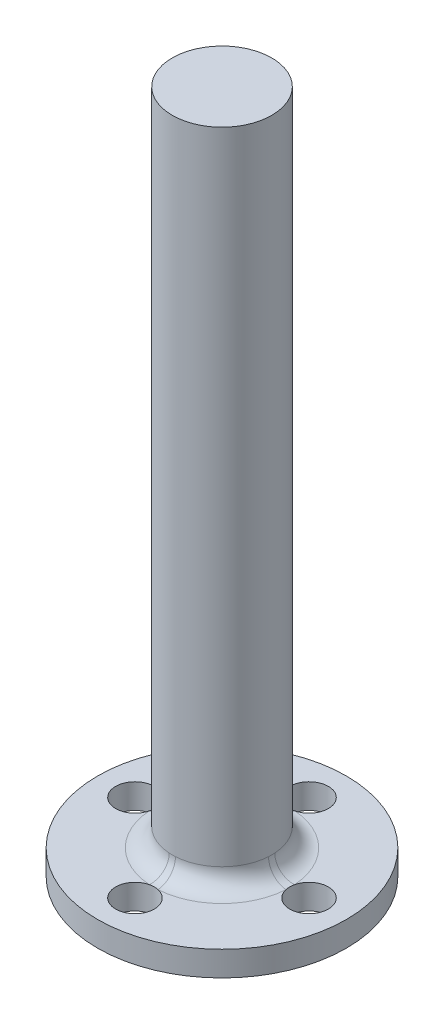
ISO-10303-21;
HEADER;
FILE_DESCRIPTION(('STEP AP214'),'2;1');
FILE_NAME('part.step','',(''),(''),'','','');
FILE_SCHEMA(('AUTOMOTIVE_DESIGN { 1 0 10303 214 1 1 1 1 }'));
ENDSEC;
DATA;
#1=APPLICATION_CONTEXT('core data for automotive mechanical design processes');
#2=APPLICATION_PROTOCOL_DEFINITION('international standard','automotive_design',2000,#1);
#3=PRODUCT_CONTEXT('',#1,'mechanical');
#4=PRODUCT('Part','Part','',(#3));
#5=PRODUCT_RELATED_PRODUCT_CATEGORY('part','',(#4));
#6=PRODUCT_DEFINITION_FORMATION('','',#4);
#7=PRODUCT_DEFINITION_CONTEXT('part definition',#1,'design');
#8=PRODUCT_DEFINITION('design','',#6,#7);
#9=PRODUCT_DEFINITION_SHAPE('','',#8);
#10=(LENGTH_UNIT() NAMED_UNIT(*) SI_UNIT(.MILLI.,.METRE.));
#11=(NAMED_UNIT(*) PLANE_ANGLE_UNIT() SI_UNIT($,.RADIAN.));
#12=(NAMED_UNIT(*) SI_UNIT($,.STERADIAN.) SOLID_ANGLE_UNIT());
#13=UNCERTAINTY_MEASURE_WITH_UNIT(LENGTH_MEASURE(1.E-05),#10,'distance_accuracy_value','');
#14=(GEOMETRIC_REPRESENTATION_CONTEXT(3) GLOBAL_UNCERTAINTY_ASSIGNED_CONTEXT((#13)) GLOBAL_UNIT_ASSIGNED_CONTEXT((#10,
#11,#12)) REPRESENTATION_CONTEXT('',''));
#15=CARTESIAN_POINT('',(0.,0.,0.));
#16=DIRECTION('',(0.,0.,1.));
#17=DIRECTION('',(1.,0.,0.));
#18=AXIS2_PLACEMENT_3D('',#15,#16,#17);
#19=CARTESIAN_POINT('',(0.,2.,0.));
#20=DIRECTION('',(0.,-1.,0.));
#21=DIRECTION('',(0.,0.,-1.));
#22=AXIS2_PLACEMENT_3D('',#19,#20,#21);
#23=CYLINDRICAL_SURFACE('',#22,10.);
#24=CARTESIAN_POINT('',(0.,2.,0.));
#25=DIRECTION('',(0.,1.,0.));
#26=DIRECTION('',(0.,0.,1.));
#27=AXIS2_PLACEMENT_3D('',#24,#25,#26);
#28=CIRCLE('',#27,10.);
#29=CARTESIAN_POINT('',(0.,2.,10.));
#30=VERTEX_POINT('',#29);
#31=EDGE_CURVE('E136',#30,#30,#28,.T.);
#32=ORIENTED_EDGE('',*,*,#31,.F.);
#33=EDGE_LOOP('',(#32));
#34=FACE_BOUND('',#33,.T.);
#35=CARTESIAN_POINT('',(0.,0.,0.));
#36=DIRECTION('',(0.,1.,0.));
#37=DIRECTION('',(0.,0.,1.));
#38=AXIS2_PLACEMENT_3D('',#35,#36,#37);
#39=CIRCLE('',#38,10.);
#40=CARTESIAN_POINT('',(0.,0.,10.));
#41=VERTEX_POINT('',#40);
#42=EDGE_CURVE('E139',#41,#41,#39,.T.);
#43=ORIENTED_EDGE('',*,*,#42,.T.);
#44=EDGE_LOOP('',(#43));
#45=FACE_BOUND('',#44,.T.);
#46=ADVANCED_FACE('F40',(#34,#45),#23,.T.);
#47=CARTESIAN_POINT('',(0.,2.,0.));
#48=DIRECTION('',(0.,1.,0.));
#49=DIRECTION('',(0.,0.,1.));
#50=AXIS2_PLACEMENT_3D('',#47,#48,#49);
#51=PLANE('',#50);
#52=CARTESIAN_POINT('',(0.,2.,7.));
#53=DIRECTION('',(0.,1.,0.));
#54=DIRECTION('',(0.,0.,1.));
#55=AXIS2_PLACEMENT_3D('',#52,#53,#54);
#56=CIRCLE('',#55,1.55);
#57=CARTESIAN_POINT('',(-0.345980887094494,2.,5.48910714285714));
#58=VERTEX_POINT('',#57);
#59=CARTESIAN_POINT('',(0.345980887094494,2.,5.48910714285714));
#60=VERTEX_POINT('',#59);
#61=EDGE_CURVE('E317',#58,#60,#56,.T.);
#62=ORIENTED_EDGE('',*,*,#61,.F.);
#63=CARTESIAN_POINT('',(0.,2.,0.));
#64=DIRECTION('',(0.,1.,0.));
#65=DIRECTION('',(0.,0.,1.));
#66=AXIS2_PLACEMENT_3D('',#63,#64,#65);
#67=CIRCLE('',#66,5.5);
#68=CARTESIAN_POINT('',(-5.48910714285714,2.,0.345980887094495));
#69=VERTEX_POINT('',#68);
#70=EDGE_CURVE('E11',#58,#69,#67,.F.);
#71=ORIENTED_EDGE('',*,*,#70,.T.);
#72=CARTESIAN_POINT('',(-7.,2.,0.));
#73=DIRECTION('',(0.,1.,0.));
#74=DIRECTION('',(0.,0.,1.));
#75=AXIS2_PLACEMENT_3D('',#72,#73,#74);
#76=CIRCLE('',#75,1.55);
#77=CARTESIAN_POINT('',(-5.48910714285714,2.,-0.345980887094495));
#78=VERTEX_POINT('',#77);
#79=EDGE_CURVE('E310',#78,#69,#76,.T.);
#80=ORIENTED_EDGE('',*,*,#79,.F.);
#81=CARTESIAN_POINT('',(0.,2.,0.));
#82=DIRECTION('',(0.,1.,0.));
#83=DIRECTION('',(0.,0.,1.));
#84=AXIS2_PLACEMENT_3D('',#81,#82,#83);
#85=CIRCLE('',#84,5.5);
#86=CARTESIAN_POINT('',(-0.345980887094494,2.,-5.48910714285714));
#87=VERTEX_POINT('',#86);
#88=EDGE_CURVE('E53',#78,#87,#85,.F.);
#89=ORIENTED_EDGE('',*,*,#88,.T.);
#90=CARTESIAN_POINT('',(0.,2.,-7.));
#91=DIRECTION('',(0.,1.,0.));
#92=DIRECTION('',(0.,0.,1.));
#93=AXIS2_PLACEMENT_3D('',#90,#91,#92);
#94=CIRCLE('',#93,1.55);
#95=CARTESIAN_POINT('',(0.345980887094494,2.,-5.48910714285714));
#96=VERTEX_POINT('',#95);
#97=EDGE_CURVE('E294',#96,#87,#94,.T.);
#98=ORIENTED_EDGE('',*,*,#97,.F.);
#99=CARTESIAN_POINT('',(0.,2.,0.));
#100=DIRECTION('',(0.,1.,0.));
#101=DIRECTION('',(0.,0.,1.));
#102=AXIS2_PLACEMENT_3D('',#99,#100,#101);
#103=CIRCLE('',#102,5.5);
#104=CARTESIAN_POINT('',(5.48910714285714,2.,-0.345980887094495));
#105=VERTEX_POINT('',#104);
#106=EDGE_CURVE('E329',#96,#105,#103,.F.);
#107=ORIENTED_EDGE('',*,*,#106,.T.);
#108=CARTESIAN_POINT('',(7.,2.,0.));
#109=DIRECTION('',(0.,1.,0.));
#110=DIRECTION('',(0.,0.,1.));
#111=AXIS2_PLACEMENT_3D('',#108,#109,#110);
#112=CIRCLE('',#111,1.55);
#113=CARTESIAN_POINT('',(5.48910714285714,2.,0.345980887094495));
#114=VERTEX_POINT('',#113);
#115=EDGE_CURVE('E305',#114,#105,#112,.T.);
#116=ORIENTED_EDGE('',*,*,#115,.F.);
#117=CARTESIAN_POINT('',(0.,2.,0.));
#118=DIRECTION('',(0.,1.,0.));
#119=DIRECTION('',(0.,0.,1.));
#120=AXIS2_PLACEMENT_3D('',#117,#118,#119);
#121=CIRCLE('',#120,5.5);
#122=EDGE_CURVE('E69',#114,#60,#121,.F.);
#123=ORIENTED_EDGE('',*,*,#122,.T.);
#124=EDGE_LOOP('',(#62,#71,#80,#89,#98,#107,#116,#123));
#125=FACE_BOUND('',#124,.T.);
#126=ORIENTED_EDGE('',*,*,#31,.T.);
#127=EDGE_LOOP('',(#126));
#128=FACE_BOUND('',#127,.T.);
#129=ADVANCED_FACE('F203',(#125,#128),#51,.T.);
#130=CARTESIAN_POINT('',(0.,0.,0.));
#131=DIRECTION('',(0.,1.,0.));
#132=DIRECTION('',(0.,0.,1.));
#133=AXIS2_PLACEMENT_3D('',#130,#131,#132);
#134=PLANE('',#133);
#135=CARTESIAN_POINT('',(0.,0.,-7.));
#136=DIRECTION('',(0.,1.,0.));
#137=DIRECTION('',(0.,0.,1.));
#138=AXIS2_PLACEMENT_3D('',#135,#136,#137);
#139=CIRCLE('',#138,1.55);
#140=CARTESIAN_POINT('',(0.,0.,-5.45));
#141=VERTEX_POINT('',#140);
#142=EDGE_CURVE('E292',#141,#141,#139,.T.);
#143=ORIENTED_EDGE('',*,*,#142,.T.);
#144=EDGE_LOOP('',(#143));
#145=FACE_BOUND('',#144,.T.);
#146=CARTESIAN_POINT('',(7.,0.,0.));
#147=DIRECTION('',(0.,1.,0.));
#148=DIRECTION('',(0.,0.,1.));
#149=AXIS2_PLACEMENT_3D('',#146,#147,#148);
#150=CIRCLE('',#149,1.55);
#151=CARTESIAN_POINT('',(7.,0.,1.55));
#152=VERTEX_POINT('',#151);
#153=EDGE_CURVE('E306',#152,#152,#150,.T.);
#154=ORIENTED_EDGE('',*,*,#153,.T.);
#155=EDGE_LOOP('',(#154));
#156=FACE_BOUND('',#155,.T.);
#157=CARTESIAN_POINT('',(-7.,0.,0.));
#158=DIRECTION('',(0.,1.,0.));
#159=DIRECTION('',(0.,0.,1.));
#160=AXIS2_PLACEMENT_3D('',#157,#158,#159);
#161=CIRCLE('',#160,1.55);
#162=CARTESIAN_POINT('',(-7.,0.,1.55));
#163=VERTEX_POINT('',#162);
#164=EDGE_CURVE('E311',#163,#163,#161,.T.);
#165=ORIENTED_EDGE('',*,*,#164,.T.);
#166=EDGE_LOOP('',(#165));
#167=FACE_BOUND('',#166,.T.);
#168=CARTESIAN_POINT('',(0.,0.,7.));
#169=DIRECTION('',(0.,1.,0.));
#170=DIRECTION('',(0.,0.,1.));
#171=AXIS2_PLACEMENT_3D('',#168,#169,#170);
#172=CIRCLE('',#171,1.55);
#173=CARTESIAN_POINT('',(0.,0.,8.55));
#174=VERTEX_POINT('',#173);
#175=EDGE_CURVE('E216',#174,#174,#172,.T.);
#176=ORIENTED_EDGE('',*,*,#175,.T.);
#177=EDGE_LOOP('',(#176));
#178=FACE_BOUND('',#177,.T.);
#179=ORIENTED_EDGE('',*,*,#42,.F.);
#180=EDGE_LOOP('',(#179));
#181=FACE_BOUND('',#180,.T.);
#182=ADVANCED_FACE('F250',(#145,#156,#167,#178,#181),#134,.F.);
#183=CARTESIAN_POINT('',(0.,0.,7.));
#184=DIRECTION('',(0.,1.,0.));
#185=DIRECTION('',(0.,0.,1.));
#186=AXIS2_PLACEMENT_3D('',#183,#184,#185);
#187=CYLINDRICAL_SURFACE('',#186,1.55);
#188=ORIENTED_EDGE('',*,*,#175,.F.);
#189=EDGE_LOOP('',(#188));
#190=FACE_BOUND('',#189,.T.);
#191=EDGE_CURVE('E314',#60,#58,#56,.T.);
#192=ORIENTED_EDGE('',*,*,#191,.T.);
#193=ORIENTED_EDGE('',*,*,#61,.T.);
#194=EDGE_LOOP('',(#192,#193));
#195=FACE_BOUND('',#194,.T.);
#196=ADVANCED_FACE('F246',(#190,#195),#187,.F.);
#197=CARTESIAN_POINT('',(-7.,0.,0.));
#198=DIRECTION('',(0.,1.,0.));
#199=DIRECTION('',(0.,0.,1.));
#200=AXIS2_PLACEMENT_3D('',#197,#198,#199);
#201=CYLINDRICAL_SURFACE('',#200,1.55);
#202=ORIENTED_EDGE('',*,*,#164,.F.);
#203=EDGE_LOOP('',(#202));
#204=FACE_BOUND('',#203,.T.);
#205=EDGE_CURVE('E130',#69,#78,#76,.T.);
#206=ORIENTED_EDGE('',*,*,#205,.T.);
#207=ORIENTED_EDGE('',*,*,#79,.T.);
#208=EDGE_LOOP('',(#206,#207));
#209=FACE_BOUND('',#208,.T.);
#210=ADVANCED_FACE('F242',(#204,#209),#201,.F.);
#211=CARTESIAN_POINT('',(7.,0.,0.));
#212=DIRECTION('',(0.,1.,0.));
#213=DIRECTION('',(0.,0.,1.));
#214=AXIS2_PLACEMENT_3D('',#211,#212,#213);
#215=CYLINDRICAL_SURFACE('',#214,1.55);
#216=ORIENTED_EDGE('',*,*,#153,.F.);
#217=EDGE_LOOP('',(#216));
#218=FACE_BOUND('',#217,.T.);
#219=EDGE_CURVE('E302',#105,#114,#112,.T.);
#220=ORIENTED_EDGE('',*,*,#219,.T.);
#221=ORIENTED_EDGE('',*,*,#115,.T.);
#222=EDGE_LOOP('',(#220,#221));
#223=FACE_BOUND('',#222,.T.);
#224=ADVANCED_FACE('F239',(#218,#223),#215,.F.);
#225=CARTESIAN_POINT('',(0.,0.,-7.));
#226=DIRECTION('',(0.,1.,0.));
#227=DIRECTION('',(0.,0.,1.));
#228=AXIS2_PLACEMENT_3D('',#225,#226,#227);
#229=CYLINDRICAL_SURFACE('',#228,1.55);
#230=ORIENTED_EDGE('',*,*,#142,.F.);
#231=EDGE_LOOP('',(#230));
#232=FACE_BOUND('',#231,.T.);
#233=ORIENTED_EDGE('',*,*,#97,.T.);
#234=EDGE_CURVE('E299',#87,#96,#94,.T.);
#235=ORIENTED_EDGE('',*,*,#234,.T.);
#236=EDGE_LOOP('',(#233,#235));
#237=FACE_BOUND('',#236,.T.);
#238=ADVANCED_FACE('F206',(#232,#237),#229,.F.);
#239=CARTESIAN_POINT('',(0.,55.,0.));
#240=DIRECTION('',(0.,-1.,0.));
#241=DIRECTION('',(0.,0.,-1.));
#242=AXIS2_PLACEMENT_3D('',#239,#240,#241);
#243=CYLINDRICAL_SURFACE('',#242,4.);
#244=CARTESIAN_POINT('',(0.,3.5,0.));
#245=DIRECTION('',(0.,1.,0.));
#246=DIRECTION('',(0.,0.,1.));
#247=AXIS2_PLACEMENT_3D('',#244,#245,#246);
#248=CIRCLE('',#247,4.);
#249=CARTESIAN_POINT('',(-3.99207792207792,3.5,0.251622463341451));
#250=VERTEX_POINT('',#249);
#251=CARTESIAN_POINT('',(-0.25162246334145,3.5,3.99207792207792));
#252=VERTEX_POINT('',#251);
#253=EDGE_CURVE('E118',#250,#252,#248,.T.);
#254=ORIENTED_EDGE('',*,*,#253,.T.);
#255=CARTESIAN_POINT('',(-0.361521076099163,3.49911207602319,3.98362931402209));
#256=CARTESIAN_POINT('',(-0.340557433812597,1.9510744450636,3.98553179990141));
#257=CARTESIAN_POINT('',(-0.481075078234115,2.,5.52654597319698));
#258=CARTESIAN_POINT('',(-0.341169289567039,3.49949305413539,3.98547628528082));
#259=CARTESIAN_POINT('',(-0.325941845869578,1.96143642629953,3.98675269966854));
#260=CARTESIAN_POINT('',(-0.457335073898442,2.,5.51879244406059));
#261=CARTESIAN_POINT('',(-0.320802799030429,3.4997247894396,3.98716731860821));
#262=CARTESIAN_POINT('',(-0.310158413698894,1.97115541888168,3.98800557620045));
#263=CARTESIAN_POINT('',(-0.432817859200321,2.,5.51142628596647));
#264=CARTESIAN_POINT('',(-0.280046115357363,3.49998614958444,3.9902370576335));
#265=CARTESIAN_POINT('',(-0.276705869880172,1.98903273135539,3.99045232067523));
#266=CARTESIAN_POINT('',(-0.3823979688548,2.,5.49768368701782));
#267=CARTESIAN_POINT('',(-0.259655922921662,3.50001578025563,3.99161577234045));
#268=CARTESIAN_POINT('',(-0.259033460153279,1.99720791225527,3.99164758750056));
#269=CARTESIAN_POINT('',(-0.356495333197441,2.,5.49130721761673));
#270=CARTESIAN_POINT('',(-0.198460993701503,3.49994609061047,3.99528264326616));
#271=CARTESIAN_POINT('',(-0.203800236794141,2.0190876302581,3.99497359486318));
#272=CARTESIAN_POINT('',(-0.276966316952157,2.,5.47398538698659));
#273=CARTESIAN_POINT('',(-0.157627507119827,3.49968822928615,3.99710192537397));
#274=CARTESIAN_POINT('',(-0.16367989946642,2.03034811905124,3.99687256001646));
#275=CARTESIAN_POINT('',(-0.221513626909851,2.,5.46484583594881));
#276=CARTESIAN_POINT('',(-0.0760813963235047,3.49929317886829,3.99948360676481));
#277=CARTESIAN_POINT('',(-0.0805479566624256,2.04509049291042,3.99940528517017));
#278=CARTESIAN_POINT('',(-0.108148905830593,2.,5.45273260020271));
#279=CARTESIAN_POINT('',(-0.0353689112574483,3.49915552949099,4.00005081303115));
#280=CARTESIAN_POINT('',(-0.0373531925887264,2.04867807985562,4.00005657630907));
#281=CARTESIAN_POINT('',(-0.0502471534790846,2.,5.44973533714329));
#282=CARTESIAN_POINT('',(0.0460574573006376,3.49917886836804,3.99994204665249));
#283=CARTESIAN_POINT('',(0.0486549396002544,2.04799760095561,3.99993546336476));
#284=CARTESIAN_POINT('',(0.0654335637877948,2.,5.45030186098863));
#285=CARTESIAN_POINT('',(0.0867713406809714,3.49933987821367,3.9992659841266));
#286=CARTESIAN_POINT('',(0.0917020616883922,2.04372526920508,3.99916229217689));
#287=CARTESIAN_POINT('',(0.123212519523378,2.,5.45386612225234));
#288=CARTESIAN_POINT('',(0.168177993408399,3.49974636985027,3.99667053621939));
#289=CARTESIAN_POINT('',(0.174124059103146,2.02769325918776,3.99642713009462));
#290=CARTESIAN_POINT('',(0.235920098341727,2.,5.46700676618722));
#291=CARTESIAN_POINT('',(0.208870744301876,3.49999189064555,3.99475057638104));
#292=CARTESIAN_POINT('',(0.213685627472917,2.01584819109445,3.99445110112391));
#293=CARTESIAN_POINT('',(0.290847391803203,2.,5.47658592659794));
#294=CARTESIAN_POINT('',(0.290171109194465,3.50000766199723,3.98966907870329));
#295=CARTESIAN_POINT('',(0.286182949380538,1.98557030469705,3.98991686675835));
#296=CARTESIAN_POINT('',(0.395698054527282,2.,5.50039317586401));
#297=CARTESIAN_POINT('',(0.330778738885873,3.49977800962225,3.98650779454913));
#298=CARTESIAN_POINT('',(0.319199572132066,1.967010148672,3.98734363627979));
#299=CARTESIAN_POINT('',(0.445622443601418,2.,5.51462031472801));
#300=CARTESIAN_POINT('',(0.412037558620527,3.49805053510408,3.97893155117973));
#301=CARTESIAN_POINT('',(0.376394115115969,1.92464418712722,3.98250281930757));
#302=CARTESIAN_POINT('',(0.539484446777143,2.,5.5460660719692));
#303=CARTESIAN_POINT('',(0.45268824553697,3.49654752122097,3.97451150881508));
#304=CARTESIAN_POINT('',(0.40048520144857,1.90068949250711,3.98023458298619));
#305=CARTESIAN_POINT('',(0.583396695549351,2.,5.56329670740981));
#306=CARTESIAN_POINT('',(0.513511318927077,3.49265880699111,3.96695401061248));
#307=CARTESIAN_POINT('',(0.42855013406295,1.86250978802111,3.97789743048194));
#308=CARTESIAN_POINT('',(0.644359131364173,2.,5.59010791085802));
#309=CARTESIAN_POINT('',(0.533768837494382,3.49108917931401,3.96427892583789));
#310=CARTESIAN_POINT('',(0.436589667355683,1.84931152950892,3.97729510669977));
#311=CARTESIAN_POINT('',(0.663869599549783,2.,5.59920996400092));
#312=CARTESIAN_POINT('',(0.574212502171614,3.48729062695154,3.95862315301435));
#313=CARTESIAN_POINT('',(0.449899931061895,1.82240956217904,3.97658633310932));
#314=CARTESIAN_POINT('',(0.701282840823423,2.,5.61756190774449));
#315=CARTESIAN_POINT('',(0.594398632030759,3.48506156084237,3.95564239950106));
#316=CARTESIAN_POINT('',(0.455147692726704,1.80870010762991,3.97648408551951));
#317=CARTESIAN_POINT('',(0.719185267974732,2.,5.6268118296543));
#318=CARTESIAN_POINT('',(0.614537470054878,3.48244607504984,3.95251106233728));
#319=CARTESIAN_POINT('',(0.4589395525944,1.79496437593095,3.97670346788248));
#320=CARTESIAN_POINT('',(0.736297623671463,2.,5.63604772467078));
#321=(BOUNDED_SURFACE() B_SPLINE_SURFACE(3,2,((#255,#256,#257),(#258,#259,#260),(#261,#262,
#263),(#264,#265,#266),(#267,#268,#269),(#270,#271,#272),(#273,#274,#275),(#276,#277,#278),
(#279,#280,#281),(#282,#283,#284),(#285,#286,#287),(#288,#289,#290),(#291,#292,#293),(#294,#295,
#296),(#297,#298,#299),(#300,#301,#302),(#303,#304,#305),(#306,#307,#308),(#309,#310,#311),
(#312,#313,#314),(#315,#316,#317),(#318,#319,#320)),.UNSPECIFIED.,.F.,.F.,
.F.) B_SPLINE_SURFACE_WITH_KNOTS((4,2,2,2,2,2,2,2,2,2,4),(3,3),(0.,0.0843006135304719,
0.168598795043869,0.337176950433966,0.505106764780137,0.67304871992376,0.84106828941148,
1.00905353916589,1.1777270116458,1.26213616851825,1.34656344099736),(0.,1.),
.UNSPECIFIED.) GEOMETRIC_REPRESENTATION_ITEM() RATIONAL_B_SPLINE_SURFACE(((1.,0.69584305437805,
1.),(1.,0.698182006969627,1.),(1.,0.700400353668558,1.),(1.,0.704533107916885,1.),(1.,
0.706447524232879,1.),(1.,0.711640612775357,1.),(1.,0.714369656833073,1.),(1.,0.717982871475651,
1.),(1.,0.718874096962592,1.),(1.,0.718705405881698,1.),(1.,0.717645348247769,1.),(1.,
0.713724421575925,1.),(1.,0.710862720519756,1.),(1.,0.703721358186997,1.),(1.,0.699441986662831,
1.),(1.,0.689952967066959,1.),(1.,0.684739579551679,1.),(1.,0.676627261368165,1.),(1.,
0.67387320544877,1.),(1.,0.668328076953154,1.),(1.,0.665536996559396,1.),(1.,0.662757908384818,1.))) REPRESENTATION_ITEM('') SURFACE());
#322=CARTESIAN_POINT('',(-0.361521076099163,3.49911207602319,3.98362931402209));
#323=CARTESIAN_POINT('',(-0.341169289567039,3.49949305413539,3.98547628528082));
#324=CARTESIAN_POINT('',(-0.320802799030428,3.4997247894396,3.98716731860821));
#325=CARTESIAN_POINT('',(-0.280046115357363,3.49998614958444,3.9902370576335));
#326=CARTESIAN_POINT('',(-0.259655922921662,3.50001578025563,3.99161577234045));
#327=CARTESIAN_POINT('',(-0.198460993701503,3.49994609061047,3.99528264326616));
#328=CARTESIAN_POINT('',(-0.157627507119827,3.49968822928615,3.99710192537397));
#329=CARTESIAN_POINT('',(-0.0760813963235048,3.49929317886829,3.99948360676481));
#330=CARTESIAN_POINT('',(-0.0353689112574484,3.49915552949099,4.00005081303115));
#331=CARTESIAN_POINT('',(0.0460574573006376,3.49917886836804,3.99994204665249));
#332=CARTESIAN_POINT('',(0.0867713406809714,3.49933987821367,3.9992659841266));
#333=CARTESIAN_POINT('',(0.168177993408399,3.49974636985027,3.99667053621939));
#334=CARTESIAN_POINT('',(0.208870744301876,3.49999189064555,3.99475057638104));
#335=CARTESIAN_POINT('',(0.290171109194465,3.50000766199723,3.98966907870329));
#336=CARTESIAN_POINT('',(0.330778738885873,3.49977800962225,3.98650779454913));
#337=CARTESIAN_POINT('',(0.412037558620527,3.49805053510408,3.97893155117973));
#338=CARTESIAN_POINT('',(0.45268824553697,3.49654752122097,3.97451150881508));
#339=CARTESIAN_POINT('',(0.513511318927077,3.49265880699111,3.96695401061248));
#340=CARTESIAN_POINT('',(0.533768837494382,3.49108917931401,3.96427892583789));
#341=CARTESIAN_POINT('',(0.574212502171614,3.48729062695154,3.95862315301435));
#342=CARTESIAN_POINT('',(0.594398632030759,3.48506156084237,3.95564239950106));
#343=CARTESIAN_POINT('',(0.614537470054878,3.48244607504984,3.95251106233728));
#344=B_SPLINE_CURVE_WITH_KNOTS('',3,(#322,#323,#324,#325,#326,#327,#328,#329,#330,#331,#332,
#333,#334,#335,#336,#337,#338,#339,#340,#341,#342,#343),.UNSPECIFIED.,.F.,.F.,(4,2,2,2,2,2,2,2,
2,2,4),(0.,0.0843006135304719,0.168598795043869,0.337176950433966,0.505106764780137,
0.67304871992376,0.84106828941148,1.00905353916589,1.1777270116458,1.26213616851825,
1.34656344099736),.UNSPECIFIED.);
#345=CARTESIAN_POINT('',(0.25162246334145,3.5,3.99207792207792));
#346=VERTEX_POINT('',#345);
#347=EDGE_CURVE('E332',#252,#346,#344,.T.);
#348=ORIENTED_EDGE('',*,*,#347,.T.);
#349=CARTESIAN_POINT('',(0.,3.5,0.));
#350=DIRECTION('',(0.,1.,0.));
#351=DIRECTION('',(0.,0.,1.));
#352=AXIS2_PLACEMENT_3D('',#349,#350,#351);
#353=CIRCLE('',#352,4.);
#354=CARTESIAN_POINT('',(3.99207792207792,3.5,0.251622463341451));
#355=VERTEX_POINT('',#354);
#356=EDGE_CURVE('E326',#346,#355,#353,.T.);
#357=ORIENTED_EDGE('',*,*,#356,.T.);
#358=CARTESIAN_POINT('',(3.98362931402209,3.49911207602319,0.361521076099161));
#359=CARTESIAN_POINT('',(3.98553179906173,1.95107444091582,0.340557443065116));
#360=CARTESIAN_POINT('',(5.52654597625501,2.,0.481075087600366));
#361=CARTESIAN_POINT('',(3.98547628528079,3.49949305413538,0.34116928956738));
#362=CARTESIAN_POINT('',(3.98675269936068,1.96143642478083,0.32594184926099));
#363=CARTESIAN_POINT('',(5.51879244518781,2.,0.457335077350503));
#364=CARTESIAN_POINT('',(3.98716731860815,3.49972478943959,0.320802799031113));
#365=CARTESIAN_POINT('',(3.98800557611651,1.97115541846797,0.310158414623307));
#366=CARTESIAN_POINT('',(5.51142628627549,2.,0.432817860146654));
#367=CARTESIAN_POINT('',(3.99023705763341,3.49998614958443,0.280046115358708));
#368=CARTESIAN_POINT('',(3.99045232075816,1.98903273176306,0.276705868968243));
#369=CARTESIAN_POINT('',(5.49768368670975,2.,0.382397967911929));
#370=CARTESIAN_POINT('',(3.99161577234034,3.50001578025563,0.259655922923325));
#371=CARTESIAN_POINT('',(3.99164758752925,1.99720791239612,0.259033459838794));
#372=CARTESIAN_POINT('',(5.49130721750974,2.,0.356495332871001));
#373=CARTESIAN_POINT('',(3.9952826432661,3.49994609061048,0.198460993702824));
#374=CARTESIAN_POINT('',(3.99497359480605,2.01908762997782,0.203800237421272));
#375=CARTESIAN_POINT('',(5.47398538720268,2.,0.276966317614831));
#376=CARTESIAN_POINT('',(3.99710192537395,3.49968822928615,0.157627507120487));
#377=CARTESIAN_POINT('',(3.99687256000111,2.03034811897582,0.163679899632544));
#378=CARTESIAN_POINT('',(5.46484583600735,2.,0.221513627086877));
#379=CARTESIAN_POINT('',(3.99948360676481,3.49929317886829,0.0760813963235036));
#380=CARTESIAN_POINT('',(3.99940528518529,2.04509049298462,0.0805479565010772));
#381=CARTESIAN_POINT('',(5.45273260014456,2.,0.108148905655759));
#382=CARTESIAN_POINT('',(4.00005081303115,3.49915552949099,0.0353689112574477));
#383=CARTESIAN_POINT('',(4.00005657631372,2.048678079879,0.0373531925481388));
#384=CARTESIAN_POINT('',(5.44973533712516,2.,0.0502471534357103));
#385=CARTESIAN_POINT('',(3.99994204665249,3.49917886836804,-0.0460574573006376));
#386=CARTESIAN_POINT('',(3.99993546336011,2.04799760093221,-0.0486549395629291));
#387=CARTESIAN_POINT('',(5.45030186100677,2.,-0.0654335637471125));
#388=CARTESIAN_POINT('',(3.9992659841266,3.49933987821367,-0.0867713406809714));
#389=CARTESIAN_POINT('',(3.99916229217336,2.04372526918552,-0.0917020616921666));
#390=CARTESIAN_POINT('',(5.45386612226672,2.,-0.123212519530111));
#391=CARTESIAN_POINT('',(3.99667053621934,3.49974636985028,-0.168177993410031));
#392=CARTESIAN_POINT('',(3.99642713009813,2.02769325920721,-0.174124059100488));
#393=CARTESIAN_POINT('',(5.4670067661731,2.,-0.235920098337252));
#394=CARTESIAN_POINT('',(3.99475057638089,3.49999189064557,-0.208870744305137));
#395=CARTESIAN_POINT('',(3.99445110113338,2.01584819114931,-0.213685627421259));
#396=CARTESIAN_POINT('',(5.47658592655931,2.,-0.290847391739939));
#397=CARTESIAN_POINT('',(3.98966907870283,3.50000766199721,-0.290171109200978));
#398=CARTESIAN_POINT('',(3.98991686674818,1.98557030463751,-0.286182949442523));
#399=CARTESIAN_POINT('',(5.50039317590543,2.,-0.395698054602872));
#400=CARTESIAN_POINT('',(3.98650779454847,3.49977800962218,-0.330778738894008));
#401=CARTESIAN_POINT('',(3.98734363624339,1.96701014845852,-0.319199572363092));
#402=CARTESIAN_POINT('',(5.51462031487397,2.,-0.4456224438746));
#403=CARTESIAN_POINT('',(3.97893155117888,3.49805053510381,-0.412037558628642));
#404=CARTESIAN_POINT('',(3.98250281934408,1.9246441873394,-0.376394114887223));
#405=CARTESIAN_POINT('',(5.54606607182851,2.,-0.53948444652033));
#406=CARTESIAN_POINT('',(3.97451150881433,3.49654752122065,-0.452688245543452));
#407=CARTESIAN_POINT('',(3.98023458312526,1.90068949332364,-0.400485200564731));
#408=CARTESIAN_POINT('',(5.56329670687568,2.,-0.583396694561672));
#409=CARTESIAN_POINT('',(3.96695401061195,3.49265880699081,-0.51351131893112));
#410=CARTESIAN_POINT('',(3.97789743041098,1.8625097875984,-0.428550134517109));
#411=CARTESIAN_POINT('',(5.59010791112835,2.,-0.64435913186534));
#412=CARTESIAN_POINT('',(3.96427892583745,3.49108917931374,-0.533768837497613));
#413=CARTESIAN_POINT('',(3.97729510649553,1.84931152829243,-0.436589668663009));
#414=CARTESIAN_POINT('',(5.59920996477235,2.,-0.663869600979042));
#415=CARTESIAN_POINT('',(3.95862315301411,3.48729062695136,-0.574212502173225));
#416=CARTESIAN_POINT('',(3.97658633331568,1.82240956341379,-0.449899929738614));
#417=CARTESIAN_POINT('',(5.61756190697432,2.,-0.701282839396772));
#418=CARTESIAN_POINT('',(3.95564239950094,3.48506156084227,-0.594398632031562));
#419=CARTESIAN_POINT('',(3.97648408627605,1.80870011217764,-0.455147687868227));
#420=CARTESIAN_POINT('',(5.62681182684087,2.,-0.719185262763066));
#421=CARTESIAN_POINT('',(3.95251106233728,3.48244607504984,-0.614537470054876));
#422=CARTESIAN_POINT('',(3.97670346994294,1.79496438837418,-0.45893953934219));
#423=CARTESIAN_POINT('',(5.63604771703612,2.,-0.736297609528661));
#424=(BOUNDED_SURFACE() B_SPLINE_SURFACE(3,2,((#358,#359,#360),(#361,#362,#363),(#364,#365,
#366),(#367,#368,#369),(#370,#371,#372),(#373,#374,#375),(#376,#377,#378),(#379,#380,#381),
(#382,#383,#384),(#385,#386,#387),(#388,#389,#390),(#391,#392,#393),(#394,#395,#396),(#397,#398,
#399),(#400,#401,#402),(#403,#404,#405),(#406,#407,#408),(#409,#410,#411),(#412,#413,#414),
(#415,#416,#417),(#418,#419,#420),(#421,#422,#423)),.UNSPECIFIED.,.F.,.F.,
.F.) B_SPLINE_SURFACE_WITH_KNOTS((4,2,2,2,2,2,2,2,2,2,4),(3,3),(0.,0.0843006135290525,
0.168598795041139,0.337176950433966,0.505106764780135,0.673048719923757,0.841068289418211,
1.00905353917935,1.17772701165254,1.26213616852162,1.34656344099736),(0.,1.),
.UNSPECIFIED.) GEOMETRIC_REPRESENTATION_ITEM() RATIONAL_B_SPLINE_SURFACE(((1.,0.695843053445838,
1.),(1.,0.698182006626003,1.),(1.,0.700400353574357,1.),(1.,0.704533108010801,1.),(1.,
0.706447524265497,1.),(1.,0.711640612709484,1.),(1.,0.714369656815219,1.),(1.,0.717982871493387,
1.),(1.,0.71887409696816,1.),(1.,0.718705405876127,1.),(1.,0.71764534824323,1.),(1.,
0.713724421580388,1.),(1.,0.71086272053212,1.),(1.,0.703721358173796,1.),(1.,0.699441986616174,
1.),(1.,0.689952967112041,1.),(1.,0.684739579722679,1.),(1.,0.676627261281675,1.),(1.,
0.67387320520189,1.),(1.,0.668328077199666,1.),(1.,0.665536997459864,1.),(1.,0.662757910828355,1.))) REPRESENTATION_ITEM('') SURFACE());
#425=CARTESIAN_POINT('',(3.98362931402209,3.49911207602319,0.361521076099161));
#426=CARTESIAN_POINT('',(3.98547628528079,3.49949305413538,0.34116928956738));
#427=CARTESIAN_POINT('',(3.98716731860815,3.49972478943959,0.320802799031113));
#428=CARTESIAN_POINT('',(3.99023705763341,3.49998614958443,0.280046115358708));
#429=CARTESIAN_POINT('',(3.99161577234034,3.50001578025563,0.259655922923325));
#430=CARTESIAN_POINT('',(3.9952826432661,3.49994609061048,0.198460993702824));
#431=CARTESIAN_POINT('',(3.99710192537395,3.49968822928615,0.157627507120487));
#432=CARTESIAN_POINT('',(3.99948360676481,3.49929317886829,0.0760813963235036));
#433=CARTESIAN_POINT('',(4.00005081303115,3.49915552949099,0.0353689112574477));
#434=CARTESIAN_POINT('',(3.99994204665249,3.49917886836804,-0.0460574573006376));
#435=CARTESIAN_POINT('',(3.9992659841266,3.49933987821367,-0.0867713406809714));
#436=CARTESIAN_POINT('',(3.99667053621934,3.49974636985028,-0.168177993410031));
#437=CARTESIAN_POINT('',(3.99475057638089,3.49999189064557,-0.208870744305137));
#438=CARTESIAN_POINT('',(3.98966907870283,3.50000766199721,-0.290171109200978));
#439=CARTESIAN_POINT('',(3.98650779454847,3.49977800962218,-0.330778738894008));
#440=CARTESIAN_POINT('',(3.97893155117887,3.49805053510381,-0.412037558628642));
#441=CARTESIAN_POINT('',(3.97451150881433,3.49654752122065,-0.452688245543452));
#442=CARTESIAN_POINT('',(3.96695401061195,3.49265880699081,-0.51351131893112));
#443=CARTESIAN_POINT('',(3.96427892583745,3.49108917931374,-0.533768837497613));
#444=CARTESIAN_POINT('',(3.95862315301411,3.48729062695136,-0.574212502173224));
#445=CARTESIAN_POINT('',(3.95564239950094,3.48506156084227,-0.594398632031562));
#446=CARTESIAN_POINT('',(3.95251106233728,3.48244607504984,-0.614537470054876));
#447=B_SPLINE_CURVE_WITH_KNOTS('',3,(#425,#426,#427,#428,#429,#430,#431,#432,#433,#434,#435,
#436,#437,#438,#439,#440,#441,#442,#443,#444,#445,#446),.UNSPECIFIED.,.F.,.F.,(4,2,2,2,2,2,2,2,
2,2,4),(0.,0.0843006135290525,0.168598795041139,0.337176950433966,0.505106764780135,
0.673048719923757,0.841068289418211,1.00905353917935,1.17772701165254,1.26213616852162,
1.34656344099736),.UNSPECIFIED.);
#448=CARTESIAN_POINT('',(3.99207792207792,3.5,-0.251622463341451));
#449=VERTEX_POINT('',#448);
#450=EDGE_CURVE('E341',#355,#449,#447,.T.);
#451=ORIENTED_EDGE('',*,*,#450,.T.);
#452=CARTESIAN_POINT('',(0.,3.5,0.));
#453=DIRECTION('',(0.,1.,0.));
#454=DIRECTION('',(0.,0.,1.));
#455=AXIS2_PLACEMENT_3D('',#452,#453,#454);
#456=CIRCLE('',#455,4.);
#457=CARTESIAN_POINT('',(0.25162246334145,3.5,-3.99207792207792));
#458=VERTEX_POINT('',#457);
#459=EDGE_CURVE('E347',#449,#458,#456,.T.);
#460=ORIENTED_EDGE('',*,*,#459,.T.);
#461=CARTESIAN_POINT('',(0.361521076099163,3.49911207602319,-3.98362931402209));
#462=CARTESIAN_POINT('',(0.340557433812596,1.9510744450636,-3.98553179990141));
#463=CARTESIAN_POINT('',(0.481075078234114,2.,-5.52654597319698));
#464=CARTESIAN_POINT('',(0.341169289568845,3.49949305413537,-3.98547628528065));
#465=CARTESIAN_POINT('',(0.325941845871934,1.96143642629826,-3.98675269966835));
#466=CARTESIAN_POINT('',(0.457335073901611,2.,-5.51879244406155));
#467=CARTESIAN_POINT('',(0.320802799034043,3.49972478943956,-3.98716731860791));
#468=CARTESIAN_POINT('',(0.31015841370273,1.9711554188796,-3.98800557620015));
#469=CARTESIAN_POINT('',(0.432817859205723,2.,-5.51142628596806));
#470=CARTESIAN_POINT('',(0.280046115364609,3.4999861495844,-3.99023705763298));
#471=CARTESIAN_POINT('',(0.276705869886642,1.9890327313522,-3.99045232067477));
#472=CARTESIAN_POINT('',(0.382397968864262,2.,-5.49768368702029));
#473=CARTESIAN_POINT('',(0.259655922930731,3.5000157802556,-3.99161577233985));
#474=CARTESIAN_POINT('',(0.259033460160912,1.99720791225177,-3.99164758750005));
#475=CARTESIAN_POINT('',(0.356495333208729,2.,-5.49130721761946));
#476=CARTESIAN_POINT('',(0.198460993715491,3.49994609061056,-3.99528264326543));
#477=CARTESIAN_POINT('',(0.203800236806363,2.01908763025402,-3.99497359486254));
#478=CARTESIAN_POINT('',(0.276966316969754,2.,-5.47398538698988));
#479=CARTESIAN_POINT('',(0.157627507136914,3.4996882292864,-3.99710192537326));
#480=CARTESIAN_POINT('',(0.163679899483592,2.03034811904698,-3.99687256001572));
#481=CARTESIAN_POINT('',(0.221513626933412,2.,-5.4648458359524));
#482=CARTESIAN_POINT('',(0.0760813963405948,3.49929317886852,-3.99948360676451));
#483=CARTESIAN_POINT('',(0.0805479566808997,2.0450904929087,-3.99940528516983));
#484=CARTESIAN_POINT('',(0.10814890585534,2.,-5.45273260020429));
#485=CARTESIAN_POINT('',(0.0353689112714376,3.49915552949105,-4.00005081303106));
#486=CARTESIAN_POINT('',(0.0373531926030858,2.04867807985549,-4.00005657630903));
#487=CARTESIAN_POINT('',(0.0502471534986592,2.,-5.44973533714349));
#488=CARTESIAN_POINT('',(-0.0460574572933799,3.49917886836797,-3.99994204665261));
#489=CARTESIAN_POINT('',(-0.0486549395941335,2.04799760095592,-3.99993546336483));
#490=CARTESIAN_POINT('',(-0.0654335637792204,2.,-5.45030186098829));
#491=CARTESIAN_POINT('',(-0.0867713406773445,3.49933987821364,-3.99926598412671));
#492=CARTESIAN_POINT('',(-0.0917020616865004,2.04372526920414,-3.99916229217673));
#493=CARTESIAN_POINT('',(-0.12321251952063,2.,-5.45386612225292));
#494=CARTESIAN_POINT('',(-0.168177993408413,3.49974636985028,-3.99667053621939));
#495=CARTESIAN_POINT('',(-0.174124059101349,2.02769325918942,-3.9964271300949));
#496=CARTESIAN_POINT('',(-0.235920098339475,2.,-5.46700676618606));
#497=CARTESIAN_POINT('',(-0.208870744301903,3.49999189064555,-3.99475057638104));
#498=CARTESIAN_POINT('',(-0.213685627467161,2.01584819110068,-3.99445110112496));
#499=CARTESIAN_POINT('',(-0.290847391795874,2.,-5.4765859265936));
#500=CARTESIAN_POINT('',(-0.290171109194517,3.50000766199723,-3.98966907870329));
#501=CARTESIAN_POINT('',(-0.286182949388859,1.98557030468999,-3.98991686675713));
#502=CARTESIAN_POINT('',(-0.395698054537029,2.,-5.50039317586891));
#503=CARTESIAN_POINT('',(-0.330778738885939,3.49977800962225,-3.98650779454912));
#504=CARTESIAN_POINT('',(-0.319199572159165,1.96701014864657,-3.98734363627545));
#505=CARTESIAN_POINT('',(-0.445622443633313,2.,-5.51462031474534));
#506=CARTESIAN_POINT('',(-0.412037558620591,3.49805053510408,-3.97893155117972));
#507=CARTESIAN_POINT('',(-0.376394115086285,1.92464418715418,-3.98250281931217));
#508=CARTESIAN_POINT('',(-0.539484446743535,2.,-5.54606607195127));
#509=CARTESIAN_POINT('',(-0.45268824553702,3.49654752122097,-3.97451150881508));
#510=CARTESIAN_POINT('',(-0.400485201340088,1.90068949260778,-3.98023458300327));
#511=CARTESIAN_POINT('',(-0.583396695427648,2.,-5.56329670734396));
#512=CARTESIAN_POINT('',(-0.513511318927108,3.49265880699111,-3.96695401061247));
#513=CARTESIAN_POINT('',(-0.428550134120681,1.86250978796793,-3.97789743047296));
#514=CARTESIAN_POINT('',(-0.644359131427499,2.,-5.59010791089204));
#515=CARTESIAN_POINT('',(-0.533768837494407,3.49108917931401,-3.96427892583789));
#516=CARTESIAN_POINT('',(-0.43658966751873,1.84931152935754,-3.97729510667431));
#517=CARTESIAN_POINT('',(-0.663869599727764,2.,-5.59920996409692));
#518=CARTESIAN_POINT('',(-0.574212502171627,3.48729062695154,-3.95862315301434));
#519=CARTESIAN_POINT('',(-0.449899930897434,1.82240956233247,-3.97658633313494));
#520=CARTESIAN_POINT('',(-0.701282840646029,2.,-5.61756190764878));
#521=CARTESIAN_POINT('',(-0.594398632030766,3.48506156084237,-3.95564239950106));
#522=CARTESIAN_POINT('',(-0.45514769212304,1.80870010819478,-3.97648408561348));
#523=CARTESIAN_POINT('',(-0.719185267327182,2.,-5.62681182930483));
#524=CARTESIAN_POINT('',(-0.614537470054878,3.48244607504984,-3.95251106233728));
#525=CARTESIAN_POINT('',(-0.458939550949309,1.79496437747561,-3.97670346813826));
#526=CARTESIAN_POINT('',(-0.736297621915817,2.,-5.63604772372304));
#527=(BOUNDED_SURFACE() B_SPLINE_SURFACE(3,2,((#461,#462,#463),(#464,#465,#466),(#467,#468,
#469),(#470,#471,#472),(#473,#474,#475),(#476,#477,#478),(#479,#480,#481),(#482,#483,#484),
(#485,#486,#487),(#488,#489,#490),(#491,#492,#493),(#494,#495,#496),(#497,#498,#499),(#500,#501,
#502),(#503,#504,#505),(#506,#507,#508),(#509,#510,#511),(#512,#513,#514),(#515,#516,#517),
(#518,#519,#520),(#521,#522,#523),(#524,#525,#526)),.UNSPECIFIED.,.F.,.F.,
.F.) B_SPLINE_SURFACE_WITH_KNOTS((4,2,2,2,2,2,2,2,2,2,4),(3,3),(0.,0.084300613522992,
0.168598795028865,0.337176950406201,0.505106764765168,0.673048719923758,0.841068289411534,
1.00905353916599,1.17772701164585,1.26213616851828,1.34656344099736),(0.,1.),
.UNSPECIFIED.) GEOMETRIC_REPRESENTATION_ITEM() RATIONAL_B_SPLINE_SURFACE(((1.,0.69584305437805,
1.),(1.,0.698182006969336,1.),(1.,0.700400353668081,1.),(1.,0.704533107916143,1.),(1.,
0.706447524232059,1.),(1.,0.711640612774371,1.),(1.,0.714369656831998,1.),(1.,0.717982871475182,
1.),(1.,0.718874096962539,1.),(1.,0.718705405881792,1.),(1.,0.71764534824757,1.),(1.,
0.713724421576298,1.),(1.,0.710862720521155,1.),(1.,0.703721358185434,1.),(1.,0.699441986657282,
1.),(1.,0.689952967072693,1.),(1.,0.684739579572761,1.),(1.,0.676627261357283,1.),(1.,
0.673873205418048,1.),(1.,0.668328076983787,1.),(1.,0.665536996671246,1.),(1.,0.662757908688151,1.))) REPRESENTATION_ITEM('') SURFACE());
#528=CARTESIAN_POINT('',(0.361521076099163,3.49911207602319,-3.98362931402209));
#529=CARTESIAN_POINT('',(0.341169289568845,3.49949305413537,-3.98547628528065));
#530=CARTESIAN_POINT('',(0.320802799034043,3.49972478943956,-3.98716731860791));
#531=CARTESIAN_POINT('',(0.280046115364609,3.4999861495844,-3.99023705763299));
#532=CARTESIAN_POINT('',(0.259655922930731,3.5000157802556,-3.99161577233985));
#533=CARTESIAN_POINT('',(0.198460993715491,3.49994609061056,-3.99528264326543));
#534=CARTESIAN_POINT('',(0.157627507136914,3.4996882292864,-3.99710192537326));
#535=CARTESIAN_POINT('',(0.0760813963405948,3.49929317886852,-3.99948360676451));
#536=CARTESIAN_POINT('',(0.0353689112714375,3.49915552949105,-4.00005081303106));
#537=CARTESIAN_POINT('',(-0.0460574572933799,3.49917886836797,-3.99994204665261));
#538=CARTESIAN_POINT('',(-0.0867713406773444,3.49933987821364,-3.99926598412671));
#539=CARTESIAN_POINT('',(-0.168177993408413,3.49974636985028,-3.99667053621939));
#540=CARTESIAN_POINT('',(-0.208870744301903,3.49999189064555,-3.99475057638104));
#541=CARTESIAN_POINT('',(-0.290171109194517,3.50000766199723,-3.98966907870329));
#542=CARTESIAN_POINT('',(-0.330778738885939,3.49977800962225,-3.98650779454912));
#543=CARTESIAN_POINT('',(-0.412037558620591,3.49805053510408,-3.97893155117972));
#544=CARTESIAN_POINT('',(-0.45268824553702,3.49654752122097,-3.97451150881508));
#545=CARTESIAN_POINT('',(-0.513511318927108,3.49265880699111,-3.96695401061247));
#546=CARTESIAN_POINT('',(-0.533768837494407,3.49108917931401,-3.96427892583789));
#547=CARTESIAN_POINT('',(-0.574212502171627,3.48729062695153,-3.95862315301434));
#548=CARTESIAN_POINT('',(-0.594398632030766,3.48506156084237,-3.95564239950106));
#549=CARTESIAN_POINT('',(-0.614537470054878,3.48244607504984,-3.95251106233728));
#550=B_SPLINE_CURVE_WITH_KNOTS('',3,(#528,#529,#530,#531,#532,#533,#534,#535,#536,#537,#538,
#539,#540,#541,#542,#543,#544,#545,#546,#547,#548,#549),.UNSPECIFIED.,.F.,.F.,(4,2,2,2,2,2,2,2,
2,2,4),(0.,0.084300613522992,0.168598795028865,0.337176950406201,0.505106764765168,
0.673048719923758,0.841068289411534,1.00905353916599,1.17772701164585,1.26213616851828,
1.34656344099736),.UNSPECIFIED.);
#551=CARTESIAN_POINT('',(-0.25162246334145,3.5,-3.99207792207792));
#552=VERTEX_POINT('',#551);
#553=EDGE_CURVE('E348',#458,#552,#550,.T.);
#554=ORIENTED_EDGE('',*,*,#553,.T.);
#555=CARTESIAN_POINT('',(0.,3.5,0.));
#556=DIRECTION('',(0.,1.,0.));
#557=DIRECTION('',(0.,0.,1.));
#558=AXIS2_PLACEMENT_3D('',#555,#556,#557);
#559=CIRCLE('',#558,4.);
#560=CARTESIAN_POINT('',(-3.99207792207792,3.5,-0.251622463341451));
#561=VERTEX_POINT('',#560);
#562=EDGE_CURVE('E120',#552,#561,#559,.T.);
#563=ORIENTED_EDGE('',*,*,#562,.T.);
#564=CARTESIAN_POINT('',(-3.98362931402209,3.49911207602319,-0.361521076099161));
#565=CARTESIAN_POINT('',(-3.98553179925933,1.95107444189188,-0.340557440887805));
#566=CARTESIAN_POINT('',(-5.52654597553539,2.,-0.481075085396292));
#567=CARTESIAN_POINT('',(-3.98547628528082,3.49949305413539,-0.341169289566979));
#568=CARTESIAN_POINT('',(-3.98675269943319,1.96143642513864,-0.325941848462505));
#569=CARTESIAN_POINT('',(-5.51879244492224,2.,-0.457335076537648));
#570=CARTESIAN_POINT('',(-3.98716731860822,3.4997247894396,-0.320802799030311));
#571=CARTESIAN_POINT('',(-3.98800557613635,1.97115541856588,-0.310158414404877));
#572=CARTESIAN_POINT('',(-5.51142628620236,2.,-0.432817859922808));
#573=CARTESIAN_POINT('',(-3.99023705763353,3.49998614958444,-0.280046115357057));
#574=CARTESIAN_POINT('',(-3.99045232073875,1.98903273166779,-0.276705869181139));
#575=CARTESIAN_POINT('',(-5.49768368678173,2.,-0.382397968131524));
#576=CARTESIAN_POINT('',(-3.99161577234048,3.50001578025563,-0.259655922921226));
#577=CARTESIAN_POINT('',(-3.9916475875226,1.99720791236363,-0.259033459910769));
#578=CARTESIAN_POINT('',(-5.49130721753439,2.,-0.356495332945045));
#579=CARTESIAN_POINT('',(-3.99528264326623,3.49994609061047,-0.198460993700211));
#580=CARTESIAN_POINT('',(-3.99497359481964,2.01908763004468,-0.203800237271944));
#581=CARTESIAN_POINT('',(-5.47398538715113,2.,-0.276966317456355));
#582=CARTESIAN_POINT('',(-3.99710192537406,3.49968822928614,-0.157627507117809));
#583=CARTESIAN_POINT('',(-3.996872560005,2.03034811899526,-0.163679899593196));
#584=CARTESIAN_POINT('',(-5.46484583599232,2.,-0.221513627044508));
#585=CARTESIAN_POINT('',(-3.99948360676487,3.49929317886828,-0.0760813963203044));
#586=CARTESIAN_POINT('',(-3.99940528518156,2.04509049296619,-0.0805479565358676));
#587=CARTESIAN_POINT('',(-5.45273260015891,2.,-0.108148905692158));
#588=CARTESIAN_POINT('',(-4.00005081303119,3.49915552949098,-0.0353689112537928));
#589=CARTESIAN_POINT('',(-4.00005657631187,2.04867807986907,-0.0373531925499995));
#590=CARTESIAN_POINT('',(-5.44973533713258,2.,-0.0502471534353344));
#591=CARTESIAN_POINT('',(-3.99994204665244,3.49917886836805,0.0460574573051996));
#592=CARTESIAN_POINT('',(-3.99993546336195,2.04799760094208,0.0486549395724671));
#593=CARTESIAN_POINT('',(-5.4503018609994,2.,0.0654335637576597));
#594=CARTESIAN_POINT('',(-3.99926598412649,3.49933987821369,0.0867713406859847));
#595=CARTESIAN_POINT('',(-3.99916229217703,2.04372526920678,0.0917020616801287));
#596=CARTESIAN_POINT('',(-5.45386612225149,2.,0.12321251951405));
#597=CARTESIAN_POINT('',(-3.99667053621944,3.49974636985025,0.168177993405079));
#598=CARTESIAN_POINT('',(-3.99642713009434,2.02769325918534,0.174124059115683));
#599=CARTESIAN_POINT('',(-5.46700676618863,2.,0.235920098355925));
#600=CARTESIAN_POINT('',(-3.99475057638158,3.49999189064546,0.208870744289779));
#601=CARTESIAN_POINT('',(-3.99445110112046,2.01584819107397,0.213685627488518));
#602=CARTESIAN_POINT('',(-5.47658592661189,2.,0.290847391820771));
#603=CARTESIAN_POINT('',(-3.98966907870535,3.50000766199731,0.290171109164859));
#604=CARTESIAN_POINT('',(-3.9899168667645,1.98557030473491,0.286182949322374));
#605=CARTESIAN_POINT('',(-5.50039317583685,2.,0.395698054451519));
#606=CARTESIAN_POINT('',(-3.98650779455222,3.49977800962257,0.330778738847535));
#607=CARTESIAN_POINT('',(-3.98734363629903,1.96701014878835,0.319199571994056));
#608=CARTESIAN_POINT('',(-5.51462031464723,2.,0.445622443428975));
#609=CARTESIAN_POINT('',(-3.97893155118387,3.49805053510541,0.412037558581378));
#610=CARTESIAN_POINT('',(-3.98250281929251,1.92464418704833,0.376394115202993));
#611=CARTESIAN_POINT('',(-5.5460660720202,2.,0.539484446860424));
#612=CARTESIAN_POINT('',(-3.97451150881873,3.49654752122255,0.452688245505691));
#613=CARTESIAN_POINT('',(-3.98023458292222,1.90068949214094,0.400485201849307));
#614=CARTESIAN_POINT('',(-5.56329670764837,2.,0.583396695984259));
#615=CARTESIAN_POINT('',(-3.96695401061502,3.49265880699257,0.513511318907565));
#616=CARTESIAN_POINT('',(-3.97789743051575,1.86250978823057,0.428550133842712));
#617=CARTESIAN_POINT('',(-5.59010791072346,2.,0.644359131112013));
#618=CARTESIAN_POINT('',(-3.96427892584001,3.49108917931535,0.53376883747879));
#619=CARTESIAN_POINT('',(-3.97729510679592,1.84931153008881,0.436589666736967));
#620=CARTESIAN_POINT('',(-5.59920996363267,2.,0.663869598865737));
#621=CARTESIAN_POINT('',(-3.95862315301549,3.4872906269524,0.574212502163837));
#622=CARTESIAN_POINT('',(-3.97658633301325,1.82240956160863,0.449899931676087));
#623=CARTESIAN_POINT('',(-5.61756190809999,2.,0.70128284148147));
#624=CARTESIAN_POINT('',(-3.95564239950166,3.48506156084288,0.594398632026879));
#625=CARTESIAN_POINT('',(-3.97648408516594,1.80870010550695,0.455147694996351));
#626=CARTESIAN_POINT('',(-5.62681183096749,2.,0.719185270407229));
#627=CARTESIAN_POINT('',(-3.95251106233728,3.48244607504984,0.614537470054876));
#628=CARTESIAN_POINT('',(-3.9767034669185,1.79496437010938,0.458939558794451));
#629=CARTESIAN_POINT('',(-5.63604772824266,2.,0.736297630288177));
#630=(BOUNDED_SURFACE() B_SPLINE_SURFACE(3,2,((#564,#565,#566),(#567,#568,#569),(#570,#571,
#572),(#573,#574,#575),(#576,#577,#578),(#579,#580,#581),(#582,#583,#584),(#585,#586,#587),
(#588,#589,#590),(#591,#592,#593),(#594,#595,#596),(#597,#598,#599),(#600,#601,#602),(#603,#604,
#605),(#606,#607,#608),(#609,#610,#611),(#612,#613,#614),(#615,#616,#617),(#618,#619,#620),
(#621,#622,#623),(#624,#625,#626),(#627,#628,#629)),.UNSPECIFIED.,.F.,.F.,
.F.) B_SPLINE_SURFACE_WITH_KNOTS((4,2,2,2,2,2,2,2,2,2,4),(3,3),(0.,0.0843006135307123,
0.168598795044648,0.337176950437739,0.505106764785786,0.673048719931272,0.841068289382751,
1.00905353910094,1.1777270116133,1.26213616850199,1.34656344099736),(0.,1.),
.UNSPECIFIED.) GEOMETRIC_REPRESENTATION_ITEM() RATIONAL_B_SPLINE_SURFACE(((1.,0.695843053665207,
1.),(1.,0.698182006706962,1.),(1.,0.700400353596651,1.),(1.,0.704533107988857,1.),(1.,
0.706447524257978,1.),(1.,0.7116406127252,1.),(1.,0.714369656819814,1.),(1.,0.717982871488996,
1.),(1.,0.718874096965834,1.),(1.,0.718705405878436,1.),(1.,0.717645348248106,1.),(1.,
0.713724421575419,1.),(1.,0.710862720515212,1.),(1.,0.703721358195505,1.),(1.,0.699441986688425,
1.),(1.,0.689952967050348,1.),(1.,0.684739579475097,1.),(1.,0.67662726141108,1.),(1.,
0.673873205566503,1.),(1.,0.668328076839302,1.),(1.,0.665536996139059,1.),(1.,0.662757907241609,1.))) REPRESENTATION_ITEM('') SURFACE());
#631=CARTESIAN_POINT('',(-3.98362931402209,3.49911207602319,-0.361521076099161));
#632=CARTESIAN_POINT('',(-3.98547628528082,3.49949305413539,-0.341169289566979));
#633=CARTESIAN_POINT('',(-3.98716731860822,3.4997247894396,-0.320802799030311));
#634=CARTESIAN_POINT('',(-3.99023705763353,3.49998614958444,-0.280046115357057));
#635=CARTESIAN_POINT('',(-3.99161577234048,3.50001578025563,-0.259655922921226));
#636=CARTESIAN_POINT('',(-3.99528264326623,3.49994609061047,-0.198460993700211));
#637=CARTESIAN_POINT('',(-3.99710192537406,3.49968822928614,-0.157627507117809));
#638=CARTESIAN_POINT('',(-3.99948360676487,3.49929317886828,-0.0760813963203044));
#639=CARTESIAN_POINT('',(-4.00005081303119,3.49915552949098,-0.0353689112537928));
#640=CARTESIAN_POINT('',(-3.99994204665244,3.49917886836805,0.0460574573051996));
#641=CARTESIAN_POINT('',(-3.99926598412649,3.49933987821369,0.0867713406859847));
#642=CARTESIAN_POINT('',(-3.99667053621944,3.49974636985025,0.168177993405079));
#643=CARTESIAN_POINT('',(-3.99475057638158,3.49999189064546,0.208870744289779));
#644=CARTESIAN_POINT('',(-3.98966907870535,3.50000766199731,0.290171109164859));
#645=CARTESIAN_POINT('',(-3.98650779455222,3.49977800962257,0.330778738847535));
#646=CARTESIAN_POINT('',(-3.97893155118387,3.49805053510541,0.412037558581378));
#647=CARTESIAN_POINT('',(-3.97451150881873,3.49654752122255,0.452688245505691));
#648=CARTESIAN_POINT('',(-3.96695401061502,3.49265880699257,0.513511318907565));
#649=CARTESIAN_POINT('',(-3.96427892584001,3.49108917931535,0.53376883747879));
#650=CARTESIAN_POINT('',(-3.95862315301549,3.4872906269524,0.574212502163837));
#651=CARTESIAN_POINT('',(-3.95564239950166,3.48506156084288,0.594398632026879));
#652=CARTESIAN_POINT('',(-3.95251106233728,3.48244607504984,0.614537470054876));
#653=B_SPLINE_CURVE_WITH_KNOTS('',3,(#631,#632,#633,#634,#635,#636,#637,#638,#639,#640,#641,
#642,#643,#644,#645,#646,#647,#648,#649,#650,#651,#652),.UNSPECIFIED.,.F.,.F.,(4,2,2,2,2,2,2,2,
2,2,4),(0.,0.0843006135307123,0.168598795044648,0.337176950437739,0.505106764785786,
0.673048719931272,0.841068289382751,1.00905353910094,1.1777270116133,1.26213616850199,
1.34656344099736),.UNSPECIFIED.);
#654=EDGE_CURVE('E112',#561,#250,#653,.T.);
#655=ORIENTED_EDGE('',*,*,#654,.T.);
#656=EDGE_LOOP('',(#254,#348,#357,#451,#460,#554,#563,#655));
#657=FACE_BOUND('',#656,.T.);
#658=CARTESIAN_POINT('',(0.,55.,0.));
#659=DIRECTION('',(0.,1.,0.));
#660=DIRECTION('',(0.,0.,1.));
#661=AXIS2_PLACEMENT_3D('',#658,#659,#660);
#662=CIRCLE('',#661,4.);
#663=CARTESIAN_POINT('',(0.,55.,4.));
#664=VERTEX_POINT('',#663);
#665=EDGE_CURVE('E212',#664,#664,#662,.T.);
#666=ORIENTED_EDGE('',*,*,#665,.F.);
#667=EDGE_LOOP('',(#666));
#668=FACE_BOUND('',#667,.T.);
#669=ADVANCED_FACE('F114',(#657,#668),#243,.T.);
#670=CARTESIAN_POINT('',(0.,55.,0.));
#671=DIRECTION('',(0.,1.,0.));
#672=DIRECTION('',(0.,0.,1.));
#673=AXIS2_PLACEMENT_3D('',#670,#671,#672);
#674=PLANE('',#673);
#675=ORIENTED_EDGE('',*,*,#665,.T.);
#676=EDGE_LOOP('',(#675));
#677=FACE_BOUND('',#676,.T.);
#678=ADVANCED_FACE('F199',(#677),#674,.T.);
#679=CARTESIAN_POINT('',(0.345980887094494,3.5,-5.48910714285714));
#680=DIRECTION('',(0.99801948051948,0.,0.0629056158353625));
#681=DIRECTION('',(0.0629056158353625,0.,-0.998019480519481));
#682=AXIS2_PLACEMENT_3D('',#679,#680,#681);
#683=CIRCLE('',#682,1.5);
#684=EDGE_CURVE('E184',#96,#458,#683,.F.);
#685=ORIENTED_EDGE('',*,*,#684,.F.);
#686=ORIENTED_EDGE('',*,*,#234,.F.);
#687=CARTESIAN_POINT('',(-0.345980887094457,3.5,-5.48910714285717));
#688=DIRECTION('',(0.998019480519481,0.,-0.0629056158353556));
#689=DIRECTION('',(-0.0629056158353556,0.,-0.998019480519481));
#690=AXIS2_PLACEMENT_3D('',#687,#688,#689);
#691=CIRCLE('',#690,1.5);
#692=EDGE_CURVE('E210',#552,#87,#691,.T.);
#693=ORIENTED_EDGE('',*,*,#692,.F.);
#694=ORIENTED_EDGE('',*,*,#553,.F.);
#695=EDGE_LOOP('',(#685,#686,#693,#694));
#696=FACE_BOUND('',#695,.T.);
#697=ADVANCED_FACE('F194',(#696),#527,.F.);
#698=CARTESIAN_POINT('',(0.,3.5,0.));
#699=DIRECTION('',(0.,1.,0.));
#700=DIRECTION('',(0.,0.,1.));
#701=AXIS2_PLACEMENT_3D('',#698,#699,#700);
#702=TOROIDAL_SURFACE('',#701,5.5,1.5);
#703=ORIENTED_EDGE('',*,*,#692,.T.);
#704=ORIENTED_EDGE('',*,*,#88,.F.);
#705=CARTESIAN_POINT('',(-5.48910714285714,3.5,-0.345980887094495));
#706=DIRECTION('',(0.0629056158353627,0.,-0.998019480519481));
#707=DIRECTION('',(-0.998019480519481,0.,-0.0629056158353627));
#708=AXIS2_PLACEMENT_3D('',#705,#706,#707);
#709=CIRCLE('',#708,1.5);
#710=EDGE_CURVE('E219',#561,#78,#709,.T.);
#711=ORIENTED_EDGE('',*,*,#710,.F.);
#712=ORIENTED_EDGE('',*,*,#562,.F.);
#713=EDGE_LOOP('',(#703,#704,#711,#712));
#714=FACE_BOUND('',#713,.T.);
#715=ADVANCED_FACE('F191',(#714),#702,.F.);
#716=CARTESIAN_POINT('',(0.,3.5,0.));
#717=DIRECTION('',(0.,1.,0.));
#718=DIRECTION('',(0.,0.,1.));
#719=AXIS2_PLACEMENT_3D('',#716,#717,#718);
#720=TOROIDAL_SURFACE('',#719,5.5,1.5);
#721=ORIENTED_EDGE('',*,*,#684,.T.);
#722=ORIENTED_EDGE('',*,*,#459,.F.);
#723=CARTESIAN_POINT('',(5.48910714285714,3.5,-0.345980887094495));
#724=DIRECTION('',(-0.0629056158353628,0.,-0.998019480519481));
#725=DIRECTION('',(-0.998019480519481,0.,0.0629056158353628));
#726=AXIS2_PLACEMENT_3D('',#723,#724,#725);
#727=CIRCLE('',#726,1.5);
#728=EDGE_CURVE('E132',#105,#449,#727,.T.);
#729=ORIENTED_EDGE('',*,*,#728,.F.);
#730=ORIENTED_EDGE('',*,*,#106,.F.);
#731=EDGE_LOOP('',(#721,#722,#729,#730));
#732=FACE_BOUND('',#731,.T.);
#733=ADVANCED_FACE('F167',(#732),#720,.F.);
#734=ORIENTED_EDGE('',*,*,#710,.T.);
#735=ORIENTED_EDGE('',*,*,#205,.F.);
#736=CARTESIAN_POINT('',(-5.48910714285717,3.5,0.345980887094459));
#737=DIRECTION('',(-0.0629056158353558,0.,-0.998019480519481));
#738=DIRECTION('',(-0.998019480519481,0.,0.0629056158353558));
#739=AXIS2_PLACEMENT_3D('',#736,#737,#738);
#740=CIRCLE('',#739,1.5);
#741=EDGE_CURVE('E127',#250,#69,#740,.T.);
#742=ORIENTED_EDGE('',*,*,#741,.F.);
#743=ORIENTED_EDGE('',*,*,#654,.F.);
#744=EDGE_LOOP('',(#734,#735,#742,#743));
#745=FACE_BOUND('',#744,.T.);
#746=ADVANCED_FACE('F128',(#745),#630,.F.);
#747=ORIENTED_EDGE('',*,*,#728,.T.);
#748=ORIENTED_EDGE('',*,*,#450,.F.);
#749=CARTESIAN_POINT('',(5.48910714285714,3.5,0.345980887094495));
#750=DIRECTION('',(-0.0629056158353627,0.,0.99801948051948));
#751=DIRECTION('',(0.998019480519481,0.,0.0629056158353627));
#752=AXIS2_PLACEMENT_3D('',#749,#750,#751);
#753=CIRCLE('',#752,1.5);
#754=EDGE_CURVE('E133',#114,#355,#753,.F.);
#755=ORIENTED_EDGE('',*,*,#754,.F.);
#756=ORIENTED_EDGE('',*,*,#219,.F.);
#757=EDGE_LOOP('',(#747,#748,#755,#756));
#758=FACE_BOUND('',#757,.T.);
#759=ADVANCED_FACE('F166',(#758),#424,.F.);
#760=CARTESIAN_POINT('',(0.,3.5,0.));
#761=DIRECTION('',(0.,1.,0.));
#762=DIRECTION('',(0.,0.,1.));
#763=AXIS2_PLACEMENT_3D('',#760,#761,#762);
#764=TOROIDAL_SURFACE('',#763,5.5,1.5);
#765=ORIENTED_EDGE('',*,*,#741,.T.);
#766=ORIENTED_EDGE('',*,*,#70,.F.);
#767=CARTESIAN_POINT('',(-0.345980887094494,3.5,5.48910714285714));
#768=DIRECTION('',(-0.998019480519481,0.,-0.0629056158353625));
#769=DIRECTION('',(-0.0629056158353625,0.,0.998019480519481));
#770=AXIS2_PLACEMENT_3D('',#767,#768,#769);
#771=CIRCLE('',#770,1.5);
#772=EDGE_CURVE('E61',#252,#58,#771,.T.);
#773=ORIENTED_EDGE('',*,*,#772,.F.);
#774=ORIENTED_EDGE('',*,*,#253,.F.);
#775=EDGE_LOOP('',(#765,#766,#773,#774));
#776=FACE_BOUND('',#775,.T.);
#777=ADVANCED_FACE('F135',(#776),#764,.F.);
#778=CARTESIAN_POINT('',(0.,3.5,0.));
#779=DIRECTION('',(0.,1.,0.));
#780=DIRECTION('',(0.,0.,1.));
#781=AXIS2_PLACEMENT_3D('',#778,#779,#780);
#782=TOROIDAL_SURFACE('',#781,5.5,1.5);
#783=ORIENTED_EDGE('',*,*,#754,.T.);
#784=ORIENTED_EDGE('',*,*,#356,.F.);
#785=CARTESIAN_POINT('',(0.345980887094494,3.5,5.48910714285714));
#786=DIRECTION('',(0.998019480519481,0.,-0.0629056158353625));
#787=DIRECTION('',(-0.0629056158353625,0.,-0.998019480519481));
#788=AXIS2_PLACEMENT_3D('',#785,#786,#787);
#789=CIRCLE('',#788,1.5);
#790=EDGE_CURVE('E323',#60,#346,#789,.T.);
#791=ORIENTED_EDGE('',*,*,#790,.F.);
#792=ORIENTED_EDGE('',*,*,#122,.F.);
#793=EDGE_LOOP('',(#783,#784,#791,#792));
#794=FACE_BOUND('',#793,.T.);
#795=ADVANCED_FACE('F274',(#794),#782,.F.);
#796=ORIENTED_EDGE('',*,*,#772,.T.);
#797=ORIENTED_EDGE('',*,*,#191,.F.);
#798=ORIENTED_EDGE('',*,*,#790,.T.);
#799=ORIENTED_EDGE('',*,*,#347,.F.);
#800=EDGE_LOOP('',(#796,#797,#798,#799));
#801=FACE_BOUND('',#800,.T.);
#802=ADVANCED_FACE('F257',(#801),#321,.F.);
#803=CLOSED_SHELL('',(#46,#129,#182,#196,#210,#224,#238,#669,#678,#697,#715,#733,#746,#759,#777,
#795,#802));
#804=MANIFOLD_SOLID_BREP('B2',#803);
#805=ADVANCED_BREP_SHAPE_REPRESENTATION('',(#18,#804),#14);
#806=SHAPE_DEFINITION_REPRESENTATION(#9,#805);
ENDSEC;
END-ISO-10303-21;
